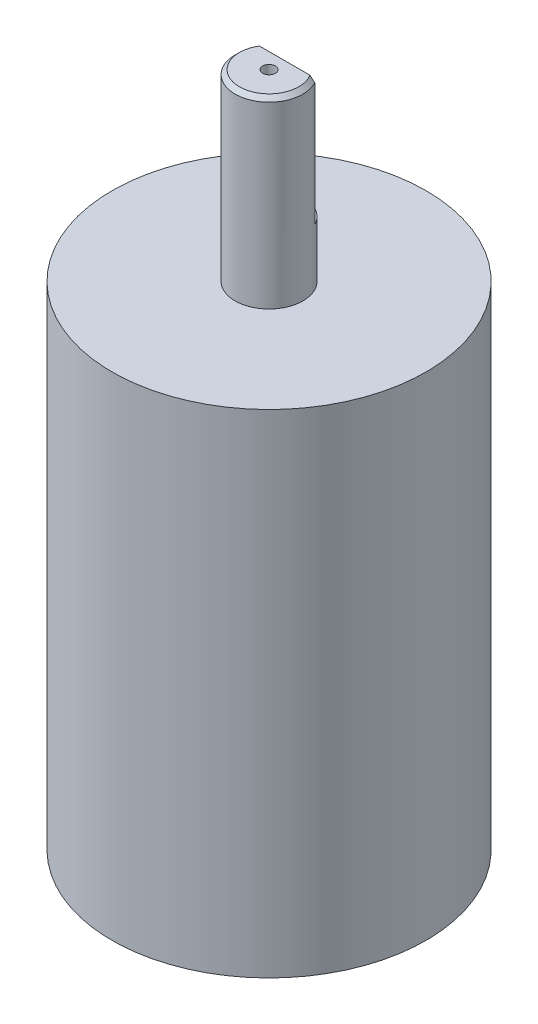
ISO-10303-21;
HEADER;
FILE_DESCRIPTION(('STEP AP214'),'2;1');
FILE_NAME('part.step','',(''),(''),'','','');
FILE_SCHEMA(('AUTOMOTIVE_DESIGN { 1 0 10303 214 1 1 1 1 }'));
ENDSEC;
DATA;
#1=APPLICATION_CONTEXT('core data for automotive mechanical design processes');
#2=APPLICATION_PROTOCOL_DEFINITION('international standard','automotive_design',2000,#1);
#3=PRODUCT_CONTEXT('',#1,'mechanical');
#4=PRODUCT('Part','Part','',(#3));
#5=PRODUCT_RELATED_PRODUCT_CATEGORY('part','',(#4));
#6=PRODUCT_DEFINITION_FORMATION('','',#4);
#7=PRODUCT_DEFINITION_CONTEXT('part definition',#1,'design');
#8=PRODUCT_DEFINITION('design','',#6,#7);
#9=PRODUCT_DEFINITION_SHAPE('','',#8);
#10=(LENGTH_UNIT() NAMED_UNIT(*) SI_UNIT(.MILLI.,.METRE.));
#11=(NAMED_UNIT(*) PLANE_ANGLE_UNIT() SI_UNIT($,.RADIAN.));
#12=(NAMED_UNIT(*) SI_UNIT($,.STERADIAN.) SOLID_ANGLE_UNIT());
#13=UNCERTAINTY_MEASURE_WITH_UNIT(LENGTH_MEASURE(1.E-05),#10,'distance_accuracy_value','');
#14=(GEOMETRIC_REPRESENTATION_CONTEXT(3) GLOBAL_UNCERTAINTY_ASSIGNED_CONTEXT((#13)) GLOBAL_UNIT_ASSIGNED_CONTEXT((#10,
#11,#12)) REPRESENTATION_CONTEXT('',''));
#15=CARTESIAN_POINT('',(0.,0.,0.));
#16=DIRECTION('',(0.,0.,1.));
#17=DIRECTION('',(1.,0.,0.));
#18=AXIS2_PLACEMENT_3D('',#15,#16,#17);
#19=CARTESIAN_POINT('',(0.,40.8,0.));
#20=DIRECTION('',(0.,1.,0.));
#21=DIRECTION('',(0.,0.,1.));
#22=AXIS2_PLACEMENT_3D('',#19,#20,#21);
#23=PLANE('',#22);
#24=CARTESIAN_POINT('',(0.,40.8,0.));
#25=DIRECTION('',(0.,1.,0.));
#26=DIRECTION('',(0.,0.,1.));
#27=AXIS2_PLACEMENT_3D('',#24,#25,#26);
#28=CIRCLE('',#27,0.75);
#29=CARTESIAN_POINT('',(0.,40.8,0.750000000000005));
#30=VERTEX_POINT('',#29);
#31=EDGE_CURVE('E131',#30,#30,#28,.T.);
#32=ORIENTED_EDGE('',*,*,#31,.F.);
#33=EDGE_LOOP('',(#32));
#34=FACE_BOUND('',#33,.T.);
#35=DIRECTION('',(1.,0.,0.));
#36=VECTOR('',#35,1.);
#37=CARTESIAN_POINT('',(-3.5516756608677,40.8,-1.83999999999999));
#38=LINE('',#37,#36);
#39=CARTESIAN_POINT('',(-2.97731422594252,40.8,-1.83999999999999));
#40=VERTEX_POINT('',#39);
#41=CARTESIAN_POINT('',(2.97731422594252,40.8,-1.83999999999999));
#42=VERTEX_POINT('',#41);
#43=EDGE_CURVE('E73',#40,#42,#38,.T.);
#44=ORIENTED_EDGE('',*,*,#43,.F.);
#45=CARTESIAN_POINT('',(0.,40.8,0.));
#46=DIRECTION('',(0.,1.,0.));
#47=DIRECTION('',(0.,0.,1.));
#48=AXIS2_PLACEMENT_3D('',#45,#46,#47);
#49=CIRCLE('',#48,3.49999999999996);
#50=EDGE_CURVE('E159',#40,#42,#49,.T.);
#51=ORIENTED_EDGE('',*,*,#50,.T.);
#52=EDGE_LOOP('',(#44,#51));
#53=FACE_BOUND('',#52,.T.);
#54=ADVANCED_FACE('F48',(#34,#53),#23,.T.);
#55=CARTESIAN_POINT('',(0.,-40.8,0.));
#56=DIRECTION('',(0.,-1.,0.));
#57=DIRECTION('',(0.,0.,-1.));
#58=AXIS2_PLACEMENT_3D('',#55,#56,#57);
#59=CYLINDRICAL_SURFACE('',#58,4.);
#60=DIRECTION('',(0.,1.,0.));
#61=VECTOR('',#60,1.);
#62=CARTESIAN_POINT('',(-3.5516756608677,25.8,-1.83999999999999));
#63=LINE('',#62,#61);
#64=CARTESIAN_POINT('',(-3.5516756608677,25.8,-1.83999999999999));
#65=VERTEX_POINT('',#64);
#66=CARTESIAN_POINT('',(-3.5516756608677,40.3,-1.83999999999999));
#67=VERTEX_POINT('',#66);
#68=EDGE_CURVE('E103',#65,#67,#63,.T.);
#69=ORIENTED_EDGE('',*,*,#68,.F.);
#70=CARTESIAN_POINT('',(0.,25.8,0.));
#71=DIRECTION('',(0.,1.,0.));
#72=DIRECTION('',(0.,0.,1.));
#73=AXIS2_PLACEMENT_3D('',#70,#71,#72);
#74=CIRCLE('',#73,4.);
#75=CARTESIAN_POINT('',(3.5516756608677,25.8,-1.83999999999999));
#76=VERTEX_POINT('',#75);
#77=EDGE_CURVE('E94',#76,#65,#74,.T.);
#78=ORIENTED_EDGE('',*,*,#77,.F.);
#79=DIRECTION('',(0.,1.,0.));
#80=VECTOR('',#79,1.);
#81=CARTESIAN_POINT('',(3.5516756608677,25.8,-1.83999999999999));
#82=LINE('',#81,#80);
#83=CARTESIAN_POINT('',(3.5516756608677,40.3,-1.83999999999999));
#84=VERTEX_POINT('',#83);
#85=EDGE_CURVE('E105',#76,#84,#82,.T.);
#86=ORIENTED_EDGE('',*,*,#85,.T.);
#87=CARTESIAN_POINT('',(0.,40.3,0.));
#88=DIRECTION('',(0.,1.,0.));
#89=DIRECTION('',(0.,0.,1.));
#90=AXIS2_PLACEMENT_3D('',#87,#88,#89);
#91=CIRCLE('',#90,4.);
#92=EDGE_CURVE('E112',#84,#67,#91,.F.);
#93=ORIENTED_EDGE('',*,*,#92,.T.);
#94=EDGE_LOOP('',(#69,#78,#86,#93));
#95=FACE_BOUND('',#94,.T.);
#96=CARTESIAN_POINT('',(0.,19.2,0.));
#97=DIRECTION('',(0.,-1.,0.));
#98=DIRECTION('',(0.,0.,-1.));
#99=AXIS2_PLACEMENT_3D('',#96,#97,#98);
#100=CIRCLE('',#99,4.);
#101=CARTESIAN_POINT('',(0.,19.2,-3.99999999999999));
#102=VERTEX_POINT('',#101);
#103=EDGE_CURVE('E147',#102,#102,#100,.T.);
#104=ORIENTED_EDGE('',*,*,#103,.F.);
#105=EDGE_LOOP('',(#104));
#106=FACE_BOUND('',#105,.T.);
#107=ADVANCED_FACE('F109',(#95,#106),#59,.T.);
#108=CARTESIAN_POINT('',(0.,19.2,-3.99999999999999));
#109=DIRECTION('',(0.,1.,0.));
#110=DIRECTION('',(0.,0.,1.));
#111=AXIS2_PLACEMENT_3D('',#108,#109,#110);
#112=PLANE('',#111);
#113=ORIENTED_EDGE('',*,*,#103,.T.);
#114=EDGE_LOOP('',(#113));
#115=FACE_BOUND('',#114,.T.);
#116=CARTESIAN_POINT('',(0.,19.2,0.));
#117=DIRECTION('',(0.,-1.,0.));
#118=DIRECTION('',(0.,0.,-1.));
#119=AXIS2_PLACEMENT_3D('',#116,#117,#118);
#120=CIRCLE('',#119,18.5);
#121=CARTESIAN_POINT('',(0.,19.2,-18.5));
#122=VERTEX_POINT('',#121);
#123=EDGE_CURVE('E141',#122,#122,#120,.T.);
#124=ORIENTED_EDGE('',*,*,#123,.F.);
#125=EDGE_LOOP('',(#124));
#126=FACE_BOUND('',#125,.T.);
#127=ADVANCED_FACE('F182',(#115,#126),#112,.T.);
#128=CARTESIAN_POINT('',(0.,-40.8,0.));
#129=DIRECTION('',(0.,-1.,0.));
#130=DIRECTION('',(0.,0.,-1.));
#131=AXIS2_PLACEMENT_3D('',#128,#129,#130);
#132=CYLINDRICAL_SURFACE('',#131,18.5);
#133=ORIENTED_EDGE('',*,*,#123,.T.);
#134=EDGE_LOOP('',(#133));
#135=FACE_BOUND('',#134,.T.);
#136=CARTESIAN_POINT('',(0.,-38.8,0.));
#137=DIRECTION('',(0.,-1.,0.));
#138=DIRECTION('',(0.,0.,-1.));
#139=AXIS2_PLACEMENT_3D('',#136,#137,#138);
#140=CIRCLE('',#139,18.5);
#141=CARTESIAN_POINT('',(0.,-38.8,-18.5));
#142=VERTEX_POINT('',#141);
#143=EDGE_CURVE('E148',#142,#142,#140,.T.);
#144=ORIENTED_EDGE('',*,*,#143,.F.);
#145=EDGE_LOOP('',(#144));
#146=FACE_BOUND('',#145,.T.);
#147=ADVANCED_FACE('F180',(#135,#146),#132,.T.);
#148=CARTESIAN_POINT('',(0.,-38.8,-18.5));
#149=DIRECTION('',(0.,-1.,0.));
#150=DIRECTION('',(0.,0.,-1.));
#151=AXIS2_PLACEMENT_3D('',#148,#149,#150);
#152=PLANE('',#151);
#153=ORIENTED_EDGE('',*,*,#143,.T.);
#154=EDGE_LOOP('',(#153));
#155=FACE_BOUND('',#154,.T.);
#156=CARTESIAN_POINT('',(0.,-38.8,0.));
#157=DIRECTION('',(0.,-1.,0.));
#158=DIRECTION('',(0.,0.,-1.));
#159=AXIS2_PLACEMENT_3D('',#156,#157,#158);
#160=CIRCLE('',#159,4.);
#161=CARTESIAN_POINT('',(0.,-38.8,-3.99999999999999));
#162=VERTEX_POINT('',#161);
#163=EDGE_CURVE('E170',#162,#162,#160,.T.);
#164=ORIENTED_EDGE('',*,*,#163,.F.);
#165=EDGE_LOOP('',(#164));
#166=FACE_BOUND('',#165,.T.);
#167=ADVANCED_FACE('F177',(#155,#166),#152,.T.);
#168=CARTESIAN_POINT('',(0.,-40.8,0.));
#169=DIRECTION('',(0.,-1.,0.));
#170=DIRECTION('',(0.,0.,-1.));
#171=AXIS2_PLACEMENT_3D('',#168,#169,#170);
#172=CYLINDRICAL_SURFACE('',#171,4.);
#173=ORIENTED_EDGE('',*,*,#163,.T.);
#174=EDGE_LOOP('',(#173));
#175=FACE_BOUND('',#174,.T.);
#176=CARTESIAN_POINT('',(0.,-40.8,0.));
#177=DIRECTION('',(0.,-1.,0.));
#178=DIRECTION('',(0.,0.,-1.));
#179=AXIS2_PLACEMENT_3D('',#176,#177,#178);
#180=CIRCLE('',#179,4.);
#181=CARTESIAN_POINT('',(0.,-40.8,-4.));
#182=VERTEX_POINT('',#181);
#183=EDGE_CURVE('E117',#182,#182,#180,.T.);
#184=ORIENTED_EDGE('',*,*,#183,.F.);
#185=EDGE_LOOP('',(#184));
#186=FACE_BOUND('',#185,.T.);
#187=ADVANCED_FACE('F189',(#175,#186),#172,.T.);
#188=CARTESIAN_POINT('',(0.,-40.8,-4.));
#189=DIRECTION('',(0.,-1.,0.));
#190=DIRECTION('',(0.,0.,-1.));
#191=AXIS2_PLACEMENT_3D('',#188,#189,#190);
#192=PLANE('',#191);
#193=CARTESIAN_POINT('',(0.,-40.8,0.));
#194=DIRECTION('',(0.,1.,0.));
#195=DIRECTION('',(0.,0.,1.));
#196=AXIS2_PLACEMENT_3D('',#193,#194,#195);
#197=CIRCLE('',#196,0.75);
#198=CARTESIAN_POINT('',(0.,-40.8,0.749999999999995));
#199=VERTEX_POINT('',#198);
#200=EDGE_CURVE('E313',#199,#199,#197,.T.);
#201=ORIENTED_EDGE('',*,*,#200,.T.);
#202=EDGE_LOOP('',(#201));
#203=FACE_BOUND('',#202,.T.);
#204=ORIENTED_EDGE('',*,*,#183,.T.);
#205=EDGE_LOOP('',(#204));
#206=FACE_BOUND('',#205,.T.);
#207=ADVANCED_FACE('F212',(#203,#206),#192,.T.);
#208=CARTESIAN_POINT('',(0.,40.3,0.));
#209=DIRECTION('',(0.,-1.,0.));
#210=DIRECTION('',(0.,0.,-1.));
#211=AXIS2_PLACEMENT_3D('',#208,#209,#210);
#212=CONICAL_SURFACE('',#211,4.,0.785398163397445);
#213=CARTESIAN_POINT('',(-7.82443180444264,36.2621313109522,-1.83999999999999));
#214=CARTESIAN_POINT('',(-7.62686544499898,36.4544386319837,-1.83999999999999));
#215=CARTESIAN_POINT('',(-7.42912028251733,36.6465628902593,-1.83999999999999));
#216=CARTESIAN_POINT('',(-7.03314182783715,37.0303199640739,-1.83999999999999));
#217=CARTESIAN_POINT('',(-6.8349085206247,37.2219527641176,-1.83999999999999));
#218=CARTESIAN_POINT('',(-6.43743154114882,37.6049789235742,-1.83999999999999));
#219=CARTESIAN_POINT('',(-6.23818663373835,37.7963710022166,-1.83999999999999));
#220=CARTESIAN_POINT('',(-5.83890360992643,38.1783167737998,-1.83999999999999));
#221=CARTESIAN_POINT('',(-5.63886551259949,38.3688704866718,-1.83999999999999));
#222=CARTESIAN_POINT('',(-5.21683785600136,38.7686408763715,-1.83999999999999));
#223=CARTESIAN_POINT('',(-4.99473162381557,38.9777346273196,-1.83999999999999));
#224=CARTESIAN_POINT('',(-4.54864466756453,39.393950211477,-1.83999999999999));
#225=CARTESIAN_POINT('',(-4.32466379812205,39.6010718890401,-1.83999999999999));
#226=CARTESIAN_POINT('',(-3.87425508888412,40.0120114407053,-1.83999999999999));
#227=CARTESIAN_POINT('',(-3.64783117109107,40.215833584753,-1.83999999999999));
#228=CARTESIAN_POINT('',(-3.30489711863947,40.5177961487791,-1.83999999999999));
#229=CARTESIAN_POINT('',(-3.19004347643892,40.6178156576021,-1.83999999999999));
#230=CARTESIAN_POINT('',(-2.95889089076619,40.8161677464592,-1.83999999999999));
#231=CARTESIAN_POINT('',(-2.8425920065171,40.9145003952268,-1.83999999999999));
#232=CARTESIAN_POINT('',(-2.64966616163778,41.0743917854051,-1.83999999999999));
#233=CARTESIAN_POINT('',(-2.57359781538161,41.1366239970328,-1.83999999999999));
#234=CARTESIAN_POINT('',(-2.42048674000117,41.2598866183181,-1.83999999999999));
#235=CARTESIAN_POINT('',(-2.34344397701755,41.3209169860241,-1.83999999999999));
#236=CARTESIAN_POINT('',(-2.18799624422883,41.441587792452,-1.83999999999999));
#237=CARTESIAN_POINT('',(-2.10958860177472,41.5012247986158,-1.83999999999999));
#238=CARTESIAN_POINT('',(-1.95130496865956,41.6185145697916,-1.83999999999999));
#239=CARTESIAN_POINT('',(-1.87142908176255,41.6761674742037,-1.83999999999999));
#240=CARTESIAN_POINT('',(-1.71136219799575,41.7878036832836,-1.83999999999999));
#241=CARTESIAN_POINT('',(-1.63120525839582,41.8418355550902,-1.83999999999999));
#242=CARTESIAN_POINT('',(-1.46867179442455,41.9465495664971,-1.83999999999999));
#243=CARTESIAN_POINT('',(-1.38629448025468,41.9972304914101,-1.83999999999999));
#244=CARTESIAN_POINT('',(-1.21914986354891,42.093807299879,-1.83999999999999));
#245=CARTESIAN_POINT('',(-1.13439220174038,42.1397197070431,-1.83999999999999));
#246=CARTESIAN_POINT('',(-0.961747715834822,42.2251648826817,-1.83999999999999));
#247=CARTESIAN_POINT('',(-0.873864116322416,42.2647040052089,-1.83999999999999));
#248=CARTESIAN_POINT('',(-0.728994933639319,42.3215012154514,-1.83999999999999));
#249=CARTESIAN_POINT('',(-0.673083100811161,42.3414894348207,-1.83999999999999));
#250=CARTESIAN_POINT('',(-0.559950835426864,42.377431761016,-1.83999999999999));
#251=CARTESIAN_POINT('',(-0.502730232394078,42.3933853390003,-1.83999999999999));
#252=CARTESIAN_POINT('',(-0.387434318225981,42.4204830174681,-1.83999999999999));
#253=CARTESIAN_POINT('',(-0.329364406259206,42.4316497635489,-1.83999999999999));
#254=CARTESIAN_POINT('',(-0.212454948571594,42.4486771041666,-1.83999999999999));
#255=CARTESIAN_POINT('',(-0.153615623077092,42.4545391847147,-1.83999999999999));
#256=CARTESIAN_POINT('',(-0.0351639031895412,42.4606219434006,-1.83999999999999));
#257=CARTESIAN_POINT('',(0.0244508981947417,42.4607967211406,-1.83999999999999));
#258=CARTESIAN_POINT('',(0.143413205093918,42.4553766872455,-1.83999999999999));
#259=CARTESIAN_POINT('',(0.202760705882969,42.449781774002,-1.83999999999999));
#260=CARTESIAN_POINT('',(0.320907261970446,42.4331457128924,-1.83999999999999));
#261=CARTESIAN_POINT('',(0.379703335351452,42.4220837298308,-1.83999999999999));
#262=CARTESIAN_POINT('',(0.496166945482089,42.3951198512406,-1.83999999999999));
#263=CARTESIAN_POINT('',(0.553834240692645,42.3792169316283,-1.83999999999999));
#264=CARTESIAN_POINT('',(0.699972084775997,42.3331748009284,-1.83999999999999));
#265=CARTESIAN_POINT('',(0.787502806813026,42.300061646723,-1.83999999999999));
#266=CARTESIAN_POINT('',(0.95935307717631,42.2263765897,-1.83999999999999));
#267=CARTESIAN_POINT('',(1.04366990835465,42.1857985375207,-1.83999999999999));
#268=CARTESIAN_POINT('',(1.20979020262292,42.0990557637322,-1.83999999999999));
#269=CARTESIAN_POINT('',(1.29158185193872,42.0528686688729,-1.83999999999999));
#270=CARTESIAN_POINT('',(1.41244032264806,41.9806140438497,-1.83999999999999));
#271=CARTESIAN_POINT('',(1.45241465751041,41.9560381676713,-1.83999999999999));
#272=CARTESIAN_POINT('',(1.53181896696623,41.906024483163,-1.83999999999999));
#273=CARTESIAN_POINT('',(1.57124896364894,41.8805867099543,-1.83999999999999));
#274=CARTESIAN_POINT('',(1.70414220856749,41.7930673061301,-1.83999999999999));
#275=CARTESIAN_POINT('',(1.79645812074447,41.7292424756928,-1.83999999999999));
#276=CARTESIAN_POINT('',(1.9789323683128,41.5985688567017,-1.83999999999999));
#277=CARTESIAN_POINT('',(2.06909021268582,41.5317193897763,-1.83999999999999));
#278=CARTESIAN_POINT('',(2.24776670341114,41.3957455832331,-1.83999999999999));
#279=CARTESIAN_POINT('',(2.33628417420858,41.3266197038199,-1.83999999999999));
#280=CARTESIAN_POINT('',(2.51197255367535,41.1866740193656,-1.83999999999999));
#281=CARTESIAN_POINT('',(2.59914338548431,41.1158541182206,-1.83999999999999));
#282=CARTESIAN_POINT('',(2.85945383613838,40.9011231295188,-1.83999999999999));
#283=CARTESIAN_POINT('',(3.03098059898069,40.755259481228,-1.83999999999999));
#284=CARTESIAN_POINT('',(3.37112310307053,40.4603426593774,-1.83999999999999));
#285=CARTESIAN_POINT('',(3.53974000215257,40.3112908098618,-1.83999999999999));
#286=CARTESIAN_POINT('',(3.87530591373488,40.0107078653099,-1.83999999999999));
#287=CARTESIAN_POINT('',(4.04225128332313,39.8591727104505,-1.83999999999999));
#288=CARTESIAN_POINT('',(4.37473129665542,39.5545333821547,-1.83999999999999));
#289=CARTESIAN_POINT('',(4.54026579800627,39.4014290537035,-1.83999999999999));
#290=CARTESIAN_POINT('',(4.87006301251523,39.0942803574866,-1.83999999999999));
#291=CARTESIAN_POINT('',(5.03432708430137,38.9402374468838,-1.83999999999999));
#292=CARTESIAN_POINT('',(5.3620498050127,38.6312970014367,-1.83999999999999));
#293=CARTESIAN_POINT('',(5.52550845126677,38.4763994637618,-1.83999999999999));
#294=CARTESIAN_POINT('',(5.86811883479323,38.1504172745766,-1.83999999999999));
#295=CARTESIAN_POINT('',(6.04720468643858,37.9792634163955,-1.83999999999999));
#296=CARTESIAN_POINT('',(6.4048440228384,37.6362875367115,-1.83999999999999));
#297=CARTESIAN_POINT('',(6.58339732090215,37.4644653206569,-1.83999999999999));
#298=CARTESIAN_POINT('',(6.93926998523466,37.1210803165067,-1.83999999999999));
#299=CARTESIAN_POINT('',(7.11659135301263,36.9495196017146,-1.83999999999999));
#300=CARTESIAN_POINT('',(7.47080074688687,36.6060658784664,-1.83999999999999));
#301=CARTESIAN_POINT('',(7.6476888946335,36.4341729954914,-1.83999999999999));
#302=CARTESIAN_POINT('',(7.82443180444264,36.2621313109522,-1.83999999999999));
#303=B_SPLINE_CURVE_WITH_KNOTS('',3,(#213,#214,#215,#216,#217,#218,#219,#220,#221,#222,#223,
#224,#225,#226,#227,#228,#229,#230,#231,#232,#233,#234,#235,#236,#237,#238,#239,#240,#241,#242,
#243,#244,#245,#246,#247,#248,#249,#250,#251,#252,#253,#254,#255,#256,#257,#258,#259,#260,#261,
#262,#263,#264,#265,#266,#267,#268,#269,#270,#271,#272,#273,#274,#275,#276,#277,#278,#279,#280,
#281,#282,#283,#284,#285,#286,#287,#288,#289,#290,#291,#292,#293,#294,#295,#296,#297,#298,#299,
#300,#301,#302),.UNSPECIFIED.,.F.,.F.,(4,2,2,2,2,2,2,2,2,2,2,2,2,2,2,2,2,2,2,2,2,2,2,2,2,2,2,2,
2,2,2,2,2,2,2,2,2,2,2,2,2,2,2,2,4),(0.,0.827122738942111,1.65427124372573,2.48310292610854,
3.31191479630052,4.2270354026259,5.14222764609945,6.05612160220742,6.51301050666458,
6.96988075007945,7.26471576033168,7.55956104390834,7.85506906537625,8.15055628233657,
8.4404970838238,8.73054241640676,9.01954658527444,9.30826081569639,9.48626974099733,
9.66430198678604,9.84148244293128,10.0186132496294,10.1971732707298,10.3757364364549,
10.5549854220404,10.7342723535195,11.0145152318425,11.2949900081795,11.5766227416457,
11.7173887495583,11.858149028297,12.194745381326,12.5314176047645,12.8683224344239,
13.2052464226447,13.8806535113986,14.5557853531718,15.2321603612594,15.908602843447,
16.5841779224025,17.2597552403332,18.0029144560893,18.7463091776848,19.4865000802261,
20.2264514812302),.UNSPECIFIED.);
#304=EDGE_CURVE('E12',#67,#40,#303,.T.);
#305=ORIENTED_EDGE('',*,*,#304,.F.);
#306=ORIENTED_EDGE('',*,*,#92,.F.);
#307=EDGE_CURVE('E54',#42,#84,#303,.T.);
#308=ORIENTED_EDGE('',*,*,#307,.F.);
#309=ORIENTED_EDGE('',*,*,#50,.F.);
#310=EDGE_LOOP('',(#305,#306,#308,#309));
#311=FACE_BOUND('',#310,.T.);
#312=ADVANCED_FACE('F51',(#311),#212,.T.);
#313=CARTESIAN_POINT('',(-3.5516756608677,25.8,-1.83999999999999));
#314=DIRECTION('',(0.,0.,1.));
#315=DIRECTION('',(0.,-1.,0.));
#316=AXIS2_PLACEMENT_3D('',#313,#314,#315);
#317=PLANE('',#316);
#318=ORIENTED_EDGE('',*,*,#304,.T.);
#319=ORIENTED_EDGE('',*,*,#43,.T.);
#320=ORIENTED_EDGE('',*,*,#307,.T.);
#321=ORIENTED_EDGE('',*,*,#85,.F.);
#322=DIRECTION('',(1.,0.,0.));
#323=VECTOR('',#322,1.);
#324=CARTESIAN_POINT('',(-3.5516756608677,25.8,-1.83999999999999));
#325=LINE('',#324,#323);
#326=EDGE_CURVE('E97',#65,#76,#325,.T.);
#327=ORIENTED_EDGE('',*,*,#326,.F.);
#328=ORIENTED_EDGE('',*,*,#68,.T.);
#329=EDGE_LOOP('',(#318,#319,#320,#321,#327,#328));
#330=FACE_BOUND('',#329,.T.);
#331=ADVANCED_FACE('F102',(#330),#317,.F.);
#332=CARTESIAN_POINT('',(0.,25.8,0.));
#333=DIRECTION('',(0.,1.,0.));
#334=DIRECTION('',(0.,0.,1.));
#335=AXIS2_PLACEMENT_3D('',#332,#333,#334);
#336=PLANE('',#335);
#337=ORIENTED_EDGE('',*,*,#77,.T.);
#338=ORIENTED_EDGE('',*,*,#326,.T.);
#339=EDGE_LOOP('',(#337,#338));
#340=FACE_BOUND('',#339,.T.);
#341=ADVANCED_FACE('F96',(#340),#336,.T.);
#342=CARTESIAN_POINT('',(0.,-40.8,0.));
#343=DIRECTION('',(0.,1.,0.));
#344=DIRECTION('',(0.,0.,1.));
#345=AXIS2_PLACEMENT_3D('',#342,#343,#344);
#346=CYLINDRICAL_SURFACE('',#345,0.75);
#347=ORIENTED_EDGE('',*,*,#200,.F.);
#348=EDGE_LOOP('',(#347));
#349=FACE_BOUND('',#348,.T.);
#350=ORIENTED_EDGE('',*,*,#31,.T.);
#351=EDGE_LOOP('',(#350));
#352=FACE_BOUND('',#351,.T.);
#353=ADVANCED_FACE('F245',(#349,#352),#346,.F.);
#354=CLOSED_SHELL('',(#54,#107,#127,#147,#167,#187,#207,#312,#331,#341,#353));
#355=MANIFOLD_SOLID_BREP('B2',#354);
#356=ADVANCED_BREP_SHAPE_REPRESENTATION('',(#18,#355),#14);
#357=SHAPE_DEFINITION_REPRESENTATION(#9,#356);
ENDSEC;
END-ISO-10303-21;
